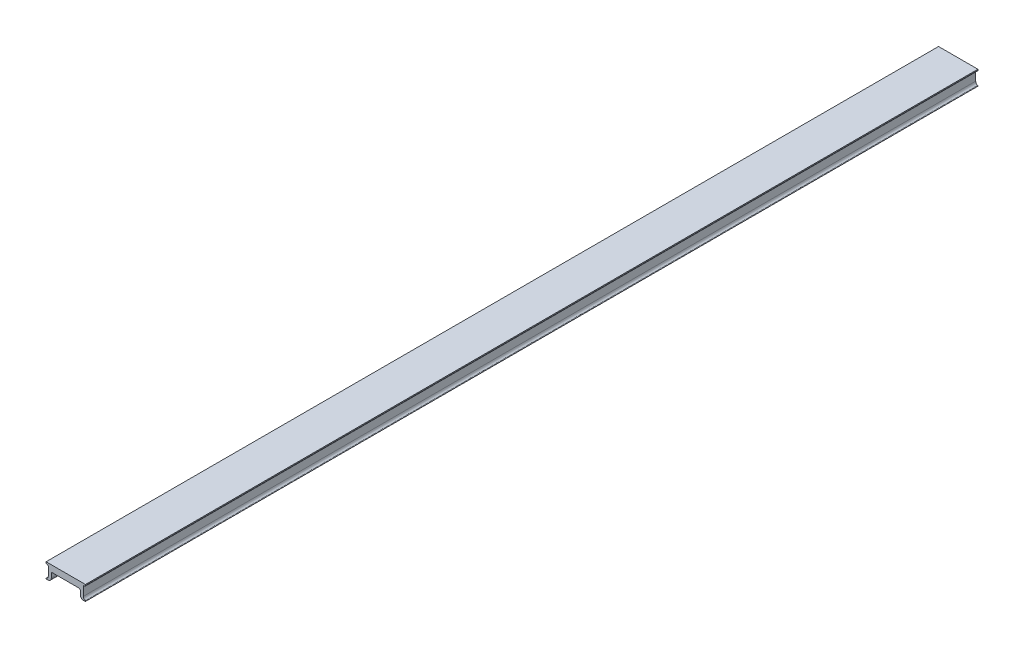
ISO-10303-21;
HEADER;
FILE_DESCRIPTION(('STEP AP214'),'2;1');
FILE_NAME('part.step','',(''),(''),'','','');
FILE_SCHEMA(('AUTOMOTIVE_DESIGN { 1 0 10303 214 1 1 1 1 }'));
ENDSEC;
DATA;
#1=APPLICATION_CONTEXT('core data for automotive mechanical design processes');
#2=APPLICATION_PROTOCOL_DEFINITION('international standard','automotive_design',2000,#1);
#3=PRODUCT_CONTEXT('',#1,'mechanical');
#4=PRODUCT('Part','Part','',(#3));
#5=PRODUCT_RELATED_PRODUCT_CATEGORY('part','',(#4));
#6=PRODUCT_DEFINITION_FORMATION('','',#4);
#7=PRODUCT_DEFINITION_CONTEXT('part definition',#1,'design');
#8=PRODUCT_DEFINITION('design','',#6,#7);
#9=PRODUCT_DEFINITION_SHAPE('','',#8);
#10=(LENGTH_UNIT() NAMED_UNIT(*) SI_UNIT(.MILLI.,.METRE.));
#11=(NAMED_UNIT(*) PLANE_ANGLE_UNIT() SI_UNIT($,.RADIAN.));
#12=(NAMED_UNIT(*) SI_UNIT($,.STERADIAN.) SOLID_ANGLE_UNIT());
#13=UNCERTAINTY_MEASURE_WITH_UNIT(LENGTH_MEASURE(1.E-05),#10,'distance_accuracy_value','');
#14=(GEOMETRIC_REPRESENTATION_CONTEXT(3) GLOBAL_UNCERTAINTY_ASSIGNED_CONTEXT((#13)) GLOBAL_UNIT_ASSIGNED_CONTEXT((#10,
#11,#12)) REPRESENTATION_CONTEXT('',''));
#15=CARTESIAN_POINT('',(0.,0.,0.));
#16=DIRECTION('',(0.,0.,1.));
#17=DIRECTION('',(1.,0.,0.));
#18=AXIS2_PLACEMENT_3D('',#15,#16,#17);
#19=CARTESIAN_POINT('',(92.0798797086991,47.7694772301879,204.));
#20=DIRECTION('',(0.,0.,-1.));
#21=DIRECTION('',(-1.,0.,0.));
#22=AXIS2_PLACEMENT_3D('',#19,#20,#21);
#23=CYLINDRICAL_SURFACE('',#22,0.0905822297343618);
#24=CARTESIAN_POINT('',(92.0798797086991,47.7694772301879,0.));
#25=DIRECTION('',(0.,0.,1.));
#26=DIRECTION('',(1.,0.,0.));
#27=AXIS2_PLACEMENT_3D('',#24,#25,#26);
#28=CIRCLE('',#27,0.0905822297343618);
#29=CARTESIAN_POINT('',(92.0765771921593,47.85999923706,0.));
#30=VERTEX_POINT('',#29);
#31=CARTESIAN_POINT('',(92.0831822252388,47.6789552233158,0.));
#32=VERTEX_POINT('',#31);
#33=EDGE_CURVE('E227',#30,#32,#28,.T.);
#34=ORIENTED_EDGE('',*,*,#33,.T.);
#35=DIRECTION('',(0.,0.,-1.));
#36=VECTOR('',#35,1.);
#37=CARTESIAN_POINT('',(92.0831822252388,47.6789552233158,204.));
#38=LINE('',#37,#36);
#39=CARTESIAN_POINT('',(92.0831822252388,47.6789552233158,204.));
#40=VERTEX_POINT('',#39);
#41=EDGE_CURVE('E11',#40,#32,#38,.T.);
#42=ORIENTED_EDGE('',*,*,#41,.F.);
#43=CARTESIAN_POINT('',(92.0798797086991,47.7694772301879,204.));
#44=DIRECTION('',(0.,0.,1.));
#45=DIRECTION('',(1.,0.,0.));
#46=AXIS2_PLACEMENT_3D('',#43,#44,#45);
#47=CIRCLE('',#46,0.0905822297343618);
#48=CARTESIAN_POINT('',(92.0765771921593,47.85999923706,204.));
#49=VERTEX_POINT('',#48);
#50=EDGE_CURVE('E273',#49,#40,#47,.T.);
#51=ORIENTED_EDGE('',*,*,#50,.F.);
#52=DIRECTION('',(0.,0.,-1.));
#53=VECTOR('',#52,1.);
#54=CARTESIAN_POINT('',(92.0765771921593,47.85999923706,204.));
#55=LINE('',#54,#53);
#56=EDGE_CURVE('E223',#49,#30,#55,.T.);
#57=ORIENTED_EDGE('',*,*,#56,.T.);
#58=EDGE_LOOP('',(#34,#42,#51,#57));
#59=FACE_BOUND('',#58,.T.);
#60=ADVANCED_FACE('F35',(#59),#23,.T.);
#61=CARTESIAN_POINT('',(92.0831822252388,47.6789552233158,204.));
#62=DIRECTION('',(0.,1.,0.));
#63=DIRECTION('',(0.,0.,1.));
#64=AXIS2_PLACEMENT_3D('',#61,#62,#63);
#65=PLANE('',#64);
#66=DIRECTION('',(1.,0.,0.));
#67=VECTOR('',#66,1.);
#68=CARTESIAN_POINT('',(92.0831822252388,47.6789552233158,0.));
#69=LINE('',#68,#67);
#70=CARTESIAN_POINT('',(92.4427267101637,47.6789552233158,0.));
#71=VERTEX_POINT('',#70);
#72=EDGE_CURVE('E230',#32,#71,#69,.T.);
#73=ORIENTED_EDGE('',*,*,#72,.T.);
#74=DIRECTION('',(0.,0.,-1.));
#75=VECTOR('',#74,1.);
#76=CARTESIAN_POINT('',(92.4427267101637,47.6789552233158,204.));
#77=LINE('',#76,#75);
#78=CARTESIAN_POINT('',(92.4427267101637,47.6789552233158,204.));
#79=VERTEX_POINT('',#78);
#80=EDGE_CURVE('E43',#79,#71,#77,.T.);
#81=ORIENTED_EDGE('',*,*,#80,.F.);
#82=DIRECTION('',(1.,0.,0.));
#83=VECTOR('',#82,1.);
#84=CARTESIAN_POINT('',(92.0831822252388,47.6789552233158,204.));
#85=LINE('',#84,#83);
#86=EDGE_CURVE('E142',#40,#79,#85,.T.);
#87=ORIENTED_EDGE('',*,*,#86,.F.);
#88=ORIENTED_EDGE('',*,*,#41,.T.);
#89=EDGE_LOOP('',(#73,#81,#87,#88));
#90=FACE_BOUND('',#89,.T.);
#91=ADVANCED_FACE('F411',(#90),#65,.F.);
#92=CARTESIAN_POINT('',(92.4427267101637,48.4365448007215,204.));
#93=DIRECTION('',(0.,0.,-1.));
#94=DIRECTION('',(-1.,0.,0.));
#95=AXIS2_PLACEMENT_3D('',#92,#93,#94);
#96=CYLINDRICAL_SURFACE('',#95,0.757589577405737);
#97=CARTESIAN_POINT('',(92.4427267101637,48.4365448007215,0.));
#98=DIRECTION('',(0.,0.,1.));
#99=DIRECTION('',(1.,0.,0.));
#100=AXIS2_PLACEMENT_3D('',#97,#98,#99);
#101=CIRCLE('',#100,0.757589577405737);
#102=CARTESIAN_POINT('',(93.2003162875694,48.4365448007215,0.));
#103=VERTEX_POINT('',#102);
#104=EDGE_CURVE('E232',#71,#103,#101,.T.);
#105=ORIENTED_EDGE('',*,*,#104,.T.);
#106=DIRECTION('',(0.,0.,-1.));
#107=VECTOR('',#106,1.);
#108=CARTESIAN_POINT('',(93.2003162875694,48.4365448007215,204.));
#109=LINE('',#108,#107);
#110=CARTESIAN_POINT('',(93.2003162875694,48.4365448007215,204.));
#111=VERTEX_POINT('',#110);
#112=EDGE_CURVE('E328',#111,#103,#109,.T.);
#113=ORIENTED_EDGE('',*,*,#112,.F.);
#114=CARTESIAN_POINT('',(92.4427267101637,48.4365448007215,204.));
#115=DIRECTION('',(0.,0.,1.));
#116=DIRECTION('',(1.,0.,0.));
#117=AXIS2_PLACEMENT_3D('',#114,#115,#116);
#118=CIRCLE('',#117,0.757589577405737);
#119=EDGE_CURVE('E336',#79,#111,#118,.T.);
#120=ORIENTED_EDGE('',*,*,#119,.F.);
#121=ORIENTED_EDGE('',*,*,#80,.T.);
#122=EDGE_LOOP('',(#105,#113,#120,#121));
#123=FACE_BOUND('',#122,.T.);
#124=ADVANCED_FACE('F334',(#123),#96,.T.);
#125=CARTESIAN_POINT('',(93.2003162875694,48.4365448007215,204.));
#126=DIRECTION('',(-1.,0.,0.));
#127=DIRECTION('',(0.,0.,1.));
#128=AXIS2_PLACEMENT_3D('',#125,#126,#127);
#129=PLANE('',#128);
#130=DIRECTION('',(0.,1.,0.));
#131=VECTOR('',#130,1.);
#132=CARTESIAN_POINT('',(93.2003162875694,48.4365448007215,0.));
#133=LINE('',#132,#131);
#134=CARTESIAN_POINT('',(93.2003162875694,49.3599996264019,0.));
#135=VERTEX_POINT('',#134);
#136=EDGE_CURVE('E234',#103,#135,#133,.T.);
#137=ORIENTED_EDGE('',*,*,#136,.T.);
#138=DIRECTION('',(0.,0.,-1.));
#139=VECTOR('',#138,1.);
#140=CARTESIAN_POINT('',(93.2003162875694,49.3599996264019,204.));
#141=LINE('',#140,#139);
#142=CARTESIAN_POINT('',(93.2003162875694,49.3599996264019,204.));
#143=VERTEX_POINT('',#142);
#144=EDGE_CURVE('E325',#143,#135,#141,.T.);
#145=ORIENTED_EDGE('',*,*,#144,.F.);
#146=DIRECTION('',(0.,1.,0.));
#147=VECTOR('',#146,1.);
#148=CARTESIAN_POINT('',(93.2003162875694,48.4365448007215,204.));
#149=LINE('',#148,#147);
#150=EDGE_CURVE('E354',#111,#143,#149,.T.);
#151=ORIENTED_EDGE('',*,*,#150,.F.);
#152=ORIENTED_EDGE('',*,*,#112,.T.);
#153=EDGE_LOOP('',(#137,#145,#151,#152));
#154=FACE_BOUND('',#153,.T.);
#155=ADVANCED_FACE('F345',(#154),#129,.F.);
#156=CARTESIAN_POINT('',(93.4588951350298,49.3599996264019,204.));
#157=DIRECTION('',(0.,0.,-1.));
#158=DIRECTION('',(-1.,0.,0.));
#159=AXIS2_PLACEMENT_3D('',#156,#157,#158);
#160=CYLINDRICAL_SURFACE('',#159,0.258578847460375);
#161=CARTESIAN_POINT('',(93.4588951350298,49.3599996264019,0.));
#162=DIRECTION('',(0.,0.,-1.));
#163=DIRECTION('',(-1.,0.,0.));
#164=AXIS2_PLACEMENT_3D('',#161,#162,#163);
#165=CIRCLE('',#164,0.258578847460375);
#166=CARTESIAN_POINT('',(93.4588951350298,49.6185784738623,0.));
#167=VERTEX_POINT('',#166);
#168=EDGE_CURVE('E236',#135,#167,#165,.T.);
#169=ORIENTED_EDGE('',*,*,#168,.T.);
#170=DIRECTION('',(0.,0.,-1.));
#171=VECTOR('',#170,1.);
#172=CARTESIAN_POINT('',(93.4588951350298,49.6185784738623,204.));
#173=LINE('',#172,#171);
#174=CARTESIAN_POINT('',(93.4588951350298,49.6185784738623,204.));
#175=VERTEX_POINT('',#174);
#176=EDGE_CURVE('E322',#175,#167,#173,.T.);
#177=ORIENTED_EDGE('',*,*,#176,.F.);
#178=CARTESIAN_POINT('',(93.4588951350298,49.3599996264019,204.));
#179=DIRECTION('',(0.,0.,-1.));
#180=DIRECTION('',(-1.,0.,0.));
#181=AXIS2_PLACEMENT_3D('',#178,#179,#180);
#182=CIRCLE('',#181,0.258578847460375);
#183=EDGE_CURVE('E351',#143,#175,#182,.T.);
#184=ORIENTED_EDGE('',*,*,#183,.F.);
#185=ORIENTED_EDGE('',*,*,#144,.T.);
#186=EDGE_LOOP('',(#169,#177,#184,#185));
#187=FACE_BOUND('',#186,.T.);
#188=ADVANCED_FACE('F349',(#187),#160,.F.);
#189=CARTESIAN_POINT('',(93.4588951350298,49.6185784738623,204.));
#190=DIRECTION('',(0.,1.,0.));
#191=DIRECTION('',(0.,0.,1.));
#192=AXIS2_PLACEMENT_3D('',#189,#190,#191);
#193=PLANE('',#192);
#194=DIRECTION('',(1.,0.,0.));
#195=VECTOR('',#194,1.);
#196=CARTESIAN_POINT('',(93.4588951350298,49.6185784738623,0.));
#197=LINE('',#196,#195);
#198=CARTESIAN_POINT('',(99.5611048649701,49.6185784738623,0.));
#199=VERTEX_POINT('',#198);
#200=EDGE_CURVE('E238',#167,#199,#197,.T.);
#201=ORIENTED_EDGE('',*,*,#200,.T.);
#202=DIRECTION('',(0.,0.,-1.));
#203=VECTOR('',#202,1.);
#204=CARTESIAN_POINT('',(99.5611048649701,49.6185784738623,204.));
#205=LINE('',#204,#203);
#206=CARTESIAN_POINT('',(99.5611048649701,49.6185784738623,204.));
#207=VERTEX_POINT('',#206);
#208=EDGE_CURVE('E319',#207,#199,#205,.T.);
#209=ORIENTED_EDGE('',*,*,#208,.F.);
#210=DIRECTION('',(1.,0.,0.));
#211=VECTOR('',#210,1.);
#212=CARTESIAN_POINT('',(93.4588951350298,49.6185784738623,204.));
#213=LINE('',#212,#211);
#214=EDGE_CURVE('E353',#175,#207,#213,.T.);
#215=ORIENTED_EDGE('',*,*,#214,.F.);
#216=ORIENTED_EDGE('',*,*,#176,.T.);
#217=EDGE_LOOP('',(#201,#209,#215,#216));
#218=FACE_BOUND('',#217,.T.);
#219=ADVANCED_FACE('F424',(#218),#193,.F.);
#220=CARTESIAN_POINT('',(99.5611048649701,49.3599996264019,204.));
#221=DIRECTION('',(0.,0.,-1.));
#222=DIRECTION('',(-1.,0.,0.));
#223=AXIS2_PLACEMENT_3D('',#220,#221,#222);
#224=CYLINDRICAL_SURFACE('',#223,0.258578847460375);
#225=CARTESIAN_POINT('',(99.5611048649701,49.3599996264019,0.));
#226=DIRECTION('',(0.,0.,-1.));
#227=DIRECTION('',(1.,0.,0.));
#228=AXIS2_PLACEMENT_3D('',#225,#226,#227);
#229=CIRCLE('',#228,0.258578847460375);
#230=CARTESIAN_POINT('',(99.8196837124304,49.3599996264019,0.));
#231=VERTEX_POINT('',#230);
#232=EDGE_CURVE('E240',#199,#231,#229,.T.);
#233=ORIENTED_EDGE('',*,*,#232,.T.);
#234=DIRECTION('',(0.,0.,-1.));
#235=VECTOR('',#234,1.);
#236=CARTESIAN_POINT('',(99.8196837124304,49.3599996264019,204.));
#237=LINE('',#236,#235);
#238=CARTESIAN_POINT('',(99.8196837124304,49.3599996264019,204.));
#239=VERTEX_POINT('',#238);
#240=EDGE_CURVE('E316',#239,#231,#237,.T.);
#241=ORIENTED_EDGE('',*,*,#240,.F.);
#242=CARTESIAN_POINT('',(99.5611048649701,49.3599996264019,204.));
#243=DIRECTION('',(0.,0.,-1.));
#244=DIRECTION('',(1.,0.,0.));
#245=AXIS2_PLACEMENT_3D('',#242,#243,#244);
#246=CIRCLE('',#245,0.258578847460375);
#247=EDGE_CURVE('E356',#207,#239,#246,.T.);
#248=ORIENTED_EDGE('',*,*,#247,.F.);
#249=ORIENTED_EDGE('',*,*,#208,.T.);
#250=EDGE_LOOP('',(#233,#241,#248,#249));
#251=FACE_BOUND('',#250,.T.);
#252=ADVANCED_FACE('F427',(#251),#224,.F.);
#253=CARTESIAN_POINT('',(99.8196837124304,48.4365448007215,204.));
#254=DIRECTION('',(1.,0.,0.));
#255=DIRECTION('',(0.,0.,-1.));
#256=AXIS2_PLACEMENT_3D('',#253,#254,#255);
#257=PLANE('',#256);
#258=DIRECTION('',(0.,-1.,0.));
#259=VECTOR('',#258,1.);
#260=CARTESIAN_POINT('',(99.8196837124304,48.4365448007215,0.));
#261=LINE('',#260,#259);
#262=CARTESIAN_POINT('',(99.8196837124304,48.4365448007215,0.));
#263=VERTEX_POINT('',#262);
#264=EDGE_CURVE('E242',#231,#263,#261,.T.);
#265=ORIENTED_EDGE('',*,*,#264,.T.);
#266=DIRECTION('',(0.,0.,-1.));
#267=VECTOR('',#266,1.);
#268=CARTESIAN_POINT('',(99.8196837124304,48.4365448007215,204.));
#269=LINE('',#268,#267);
#270=CARTESIAN_POINT('',(99.8196837124304,48.4365448007215,204.));
#271=VERTEX_POINT('',#270);
#272=EDGE_CURVE('E313',#271,#263,#269,.T.);
#273=ORIENTED_EDGE('',*,*,#272,.F.);
#274=DIRECTION('',(0.,-1.,0.));
#275=VECTOR('',#274,1.);
#276=CARTESIAN_POINT('',(99.8196837124304,48.4365448007215,204.));
#277=LINE('',#276,#275);
#278=EDGE_CURVE('E362',#239,#271,#277,.T.);
#279=ORIENTED_EDGE('',*,*,#278,.F.);
#280=ORIENTED_EDGE('',*,*,#240,.T.);
#281=EDGE_LOOP('',(#265,#273,#279,#280));
#282=FACE_BOUND('',#281,.T.);
#283=ADVANCED_FACE('F431',(#282),#257,.F.);
#284=CARTESIAN_POINT('',(100.577273289836,48.4365448007215,204.));
#285=DIRECTION('',(0.,0.,-1.));
#286=DIRECTION('',(-1.,0.,0.));
#287=AXIS2_PLACEMENT_3D('',#284,#285,#286);
#288=CYLINDRICAL_SURFACE('',#287,0.757589577405737);
#289=CARTESIAN_POINT('',(100.577273289836,48.4365448007215,0.));
#290=DIRECTION('',(0.,0.,1.));
#291=DIRECTION('',(-1.,0.,0.));
#292=AXIS2_PLACEMENT_3D('',#289,#290,#291);
#293=CIRCLE('',#292,0.757589577405737);
#294=CARTESIAN_POINT('',(100.577273289836,47.6789552233158,0.));
#295=VERTEX_POINT('',#294);
#296=EDGE_CURVE('E244',#263,#295,#293,.T.);
#297=ORIENTED_EDGE('',*,*,#296,.T.);
#298=DIRECTION('',(0.,0.,-1.));
#299=VECTOR('',#298,1.);
#300=CARTESIAN_POINT('',(100.577273289836,47.6789552233158,204.));
#301=LINE('',#300,#299);
#302=CARTESIAN_POINT('',(100.577273289836,47.6789552233158,204.));
#303=VERTEX_POINT('',#302);
#304=EDGE_CURVE('E310',#303,#295,#301,.T.);
#305=ORIENTED_EDGE('',*,*,#304,.F.);
#306=CARTESIAN_POINT('',(100.577273289836,48.4365448007215,204.));
#307=DIRECTION('',(0.,0.,1.));
#308=DIRECTION('',(-1.,0.,0.));
#309=AXIS2_PLACEMENT_3D('',#306,#307,#308);
#310=CIRCLE('',#309,0.757589577405737);
#311=EDGE_CURVE('E364',#271,#303,#310,.T.);
#312=ORIENTED_EDGE('',*,*,#311,.F.);
#313=ORIENTED_EDGE('',*,*,#272,.T.);
#314=EDGE_LOOP('',(#297,#305,#312,#313));
#315=FACE_BOUND('',#314,.T.);
#316=ADVANCED_FACE('F435',(#315),#288,.T.);
#317=CARTESIAN_POINT('',(100.936817774761,47.6789552233158,204.));
#318=DIRECTION('',(0.,1.,0.));
#319=DIRECTION('',(0.,0.,1.));
#320=AXIS2_PLACEMENT_3D('',#317,#318,#319);
#321=PLANE('',#320);
#322=DIRECTION('',(1.,0.,0.));
#323=VECTOR('',#322,1.);
#324=CARTESIAN_POINT('',(100.936817774761,47.6789552233158,0.));
#325=LINE('',#324,#323);
#326=CARTESIAN_POINT('',(100.936817774761,47.6789552233158,0.));
#327=VERTEX_POINT('',#326);
#328=EDGE_CURVE('E246',#295,#327,#325,.T.);
#329=ORIENTED_EDGE('',*,*,#328,.T.);
#330=DIRECTION('',(0.,0.,-1.));
#331=VECTOR('',#330,1.);
#332=CARTESIAN_POINT('',(100.936817774761,47.6789552233158,204.));
#333=LINE('',#332,#331);
#334=CARTESIAN_POINT('',(100.936817774761,47.6789552233158,204.));
#335=VERTEX_POINT('',#334);
#336=EDGE_CURVE('E307',#335,#327,#333,.T.);
#337=ORIENTED_EDGE('',*,*,#336,.F.);
#338=DIRECTION('',(1.,0.,0.));
#339=VECTOR('',#338,1.);
#340=CARTESIAN_POINT('',(100.936817774761,47.6789552233158,204.));
#341=LINE('',#340,#339);
#342=EDGE_CURVE('E366',#303,#335,#341,.T.);
#343=ORIENTED_EDGE('',*,*,#342,.F.);
#344=ORIENTED_EDGE('',*,*,#304,.T.);
#345=EDGE_LOOP('',(#329,#337,#343,#344));
#346=FACE_BOUND('',#345,.T.);
#347=ADVANCED_FACE('F439',(#346),#321,.F.);
#348=CARTESIAN_POINT('',(100.940120291301,47.7694772301879,204.));
#349=DIRECTION('',(0.,0.,-1.));
#350=DIRECTION('',(-1.,0.,0.));
#351=AXIS2_PLACEMENT_3D('',#348,#349,#350);
#352=CYLINDRICAL_SURFACE('',#351,0.0905822297343653);
#353=CARTESIAN_POINT('',(100.940120291301,47.7694772301879,0.));
#354=DIRECTION('',(0.,0.,1.));
#355=DIRECTION('',(-1.,0.,0.));
#356=AXIS2_PLACEMENT_3D('',#353,#354,#355);
#357=CIRCLE('',#356,0.0905822297343653);
#358=CARTESIAN_POINT('',(100.943422807841,47.85999923706,0.));
#359=VERTEX_POINT('',#358);
#360=EDGE_CURVE('E248',#327,#359,#357,.T.);
#361=ORIENTED_EDGE('',*,*,#360,.T.);
#362=DIRECTION('',(0.,0.,-1.));
#363=VECTOR('',#362,1.);
#364=CARTESIAN_POINT('',(100.943422807841,47.85999923706,204.));
#365=LINE('',#364,#363);
#366=CARTESIAN_POINT('',(100.943422807841,47.85999923706,204.));
#367=VERTEX_POINT('',#366);
#368=EDGE_CURVE('E304',#367,#359,#365,.T.);
#369=ORIENTED_EDGE('',*,*,#368,.F.);
#370=CARTESIAN_POINT('',(100.940120291301,47.7694772301879,204.));
#371=DIRECTION('',(0.,0.,1.));
#372=DIRECTION('',(-1.,0.,0.));
#373=AXIS2_PLACEMENT_3D('',#370,#371,#372);
#374=CIRCLE('',#373,0.0905822297343653);
#375=EDGE_CURVE('E368',#335,#367,#374,.T.);
#376=ORIENTED_EDGE('',*,*,#375,.F.);
#377=ORIENTED_EDGE('',*,*,#336,.T.);
#378=EDGE_LOOP('',(#361,#369,#376,#377));
#379=FACE_BOUND('',#378,.T.);
#380=ADVANCED_FACE('F443',(#379),#352,.T.);
#381=CARTESIAN_POINT('',(101.109541588619,48.4365448007215,204.));
#382=DIRECTION('',(0.,0.,-1.));
#383=DIRECTION('',(-1.,0.,0.));
#384=AXIS2_PLACEMENT_3D('',#381,#382,#383);
#385=CYLINDRICAL_SURFACE('',#384,0.600000196920859);
#386=CARTESIAN_POINT('',(101.109541588619,48.4365448007215,0.));
#387=DIRECTION('',(0.,0.,-1.));
#388=DIRECTION('',(-1.,0.,0.));
#389=AXIS2_PLACEMENT_3D('',#386,#387,#388);
#390=CIRCLE('',#389,0.600000196920859);
#391=CARTESIAN_POINT('',(100.51,48.4599994339809,0.));
#392=VERTEX_POINT('',#391);
#393=EDGE_CURVE('E250',#359,#392,#390,.T.);
#394=ORIENTED_EDGE('',*,*,#393,.T.);
#395=DIRECTION('',(0.,0.,-1.));
#396=VECTOR('',#395,1.);
#397=CARTESIAN_POINT('',(100.51,48.4599994339809,204.));
#398=LINE('',#397,#396);
#399=CARTESIAN_POINT('',(100.51,48.4599994339809,204.));
#400=VERTEX_POINT('',#399);
#401=EDGE_CURVE('E301',#400,#392,#398,.T.);
#402=ORIENTED_EDGE('',*,*,#401,.F.);
#403=CARTESIAN_POINT('',(101.109541588619,48.4365448007215,204.));
#404=DIRECTION('',(0.,0.,-1.));
#405=DIRECTION('',(-1.,0.,0.));
#406=AXIS2_PLACEMENT_3D('',#403,#404,#405);
#407=CIRCLE('',#406,0.600000196920859);
#408=EDGE_CURVE('E370',#367,#400,#407,.T.);
#409=ORIENTED_EDGE('',*,*,#408,.F.);
#410=ORIENTED_EDGE('',*,*,#368,.T.);
#411=EDGE_LOOP('',(#394,#402,#409,#410));
#412=FACE_BOUND('',#411,.T.);
#413=ADVANCED_FACE('F447',(#412),#385,.F.);
#414=CARTESIAN_POINT('',(100.51,48.4599994339809,204.));
#415=DIRECTION('',(-1.,0.,0.));
#416=DIRECTION('',(0.,-1.,0.));
#417=AXIS2_PLACEMENT_3D('',#414,#415,#416);
#418=PLANE('',#417);
#419=DIRECTION('',(0.,1.,0.));
#420=VECTOR('',#419,1.);
#421=CARTESIAN_POINT('',(100.51,48.4599994339809,0.));
#422=LINE('',#421,#420);
#423=CARTESIAN_POINT('',(100.51,50.4599994339809,0.));
#424=VERTEX_POINT('',#423);
#425=EDGE_CURVE('E252',#392,#424,#422,.T.);
#426=ORIENTED_EDGE('',*,*,#425,.T.);
#427=DIRECTION('',(0.,0.,-1.));
#428=VECTOR('',#427,1.);
#429=CARTESIAN_POINT('',(100.51,50.4599994339809,204.));
#430=LINE('',#429,#428);
#431=CARTESIAN_POINT('',(100.51,50.4599994339809,204.));
#432=VERTEX_POINT('',#431);
#433=EDGE_CURVE('E298',#432,#424,#430,.T.);
#434=ORIENTED_EDGE('',*,*,#433,.F.);
#435=DIRECTION('',(0.,1.,0.));
#436=VECTOR('',#435,1.);
#437=CARTESIAN_POINT('',(100.51,48.4599994339809,204.));
#438=LINE('',#437,#436);
#439=EDGE_CURVE('E372',#400,#432,#438,.T.);
#440=ORIENTED_EDGE('',*,*,#439,.F.);
#441=ORIENTED_EDGE('',*,*,#401,.T.);
#442=EDGE_LOOP('',(#426,#434,#440,#441));
#443=FACE_BOUND('',#442,.T.);
#444=ADVANCED_FACE('F451',(#443),#418,.F.);
#445=CARTESIAN_POINT('',(100.710000373598,50.4599994339809,204.));
#446=DIRECTION('',(0.,0.,-1.));
#447=DIRECTION('',(-1.,0.,0.));
#448=AXIS2_PLACEMENT_3D('',#445,#446,#447);
#449=CYLINDRICAL_SURFACE('',#448,0.200000373597978);
#450=CARTESIAN_POINT('',(100.710000373598,50.4599994339809,0.));
#451=DIRECTION('',(0.,0.,-1.));
#452=DIRECTION('',(-1.,0.,0.));
#453=AXIS2_PLACEMENT_3D('',#450,#451,#452);
#454=CIRCLE('',#453,0.200000373597978);
#455=CARTESIAN_POINT('',(100.710000373598,50.6599998075789,0.));
#456=VERTEX_POINT('',#455);
#457=EDGE_CURVE('E254',#424,#456,#454,.T.);
#458=ORIENTED_EDGE('',*,*,#457,.T.);
#459=DIRECTION('',(0.,0.,-1.));
#460=VECTOR('',#459,1.);
#461=CARTESIAN_POINT('',(100.710000373598,50.6599998075789,204.));
#462=LINE('',#461,#460);
#463=CARTESIAN_POINT('',(100.710000373598,50.6599998075789,204.));
#464=VERTEX_POINT('',#463);
#465=EDGE_CURVE('E295',#464,#456,#462,.T.);
#466=ORIENTED_EDGE('',*,*,#465,.F.);
#467=CARTESIAN_POINT('',(100.710000373598,50.4599994339809,204.));
#468=DIRECTION('',(0.,0.,-1.));
#469=DIRECTION('',(-1.,0.,0.));
#470=AXIS2_PLACEMENT_3D('',#467,#468,#469);
#471=CIRCLE('',#470,0.200000373597978);
#472=EDGE_CURVE('E374',#432,#464,#471,.T.);
#473=ORIENTED_EDGE('',*,*,#472,.F.);
#474=ORIENTED_EDGE('',*,*,#433,.T.);
#475=EDGE_LOOP('',(#458,#466,#473,#474));
#476=FACE_BOUND('',#475,.T.);
#477=ADVANCED_FACE('F455',(#476),#449,.F.);
#478=CARTESIAN_POINT('',(100.710000373598,50.6599998075789,204.));
#479=DIRECTION('',(0.,1.,0.));
#480=DIRECTION('',(0.,0.,1.));
#481=AXIS2_PLACEMENT_3D('',#478,#479,#480);
#482=PLANE('',#481);
#483=DIRECTION('',(1.,0.,0.));
#484=VECTOR('',#483,1.);
#485=CARTESIAN_POINT('',(100.710000373598,50.6599998075789,0.));
#486=LINE('',#485,#484);
#487=CARTESIAN_POINT('',(100.810000144262,50.6599998075789,0.));
#488=VERTEX_POINT('',#487);
#489=EDGE_CURVE('E256',#456,#488,#486,.T.);
#490=ORIENTED_EDGE('',*,*,#489,.T.);
#491=DIRECTION('',(0.,0.,-1.));
#492=VECTOR('',#491,1.);
#493=CARTESIAN_POINT('',(100.810000144262,50.6599998075789,204.));
#494=LINE('',#493,#492);
#495=CARTESIAN_POINT('',(100.810000144262,50.6599998075789,204.));
#496=VERTEX_POINT('',#495);
#497=EDGE_CURVE('E292',#496,#488,#494,.T.);
#498=ORIENTED_EDGE('',*,*,#497,.F.);
#499=DIRECTION('',(1.,0.,0.));
#500=VECTOR('',#499,1.);
#501=CARTESIAN_POINT('',(100.710000373598,50.6599998075789,204.));
#502=LINE('',#501,#500);
#503=EDGE_CURVE('E376',#464,#496,#502,.T.);
#504=ORIENTED_EDGE('',*,*,#503,.F.);
#505=ORIENTED_EDGE('',*,*,#465,.T.);
#506=EDGE_LOOP('',(#490,#498,#504,#505));
#507=FACE_BOUND('',#506,.T.);
#508=ADVANCED_FACE('F459',(#507),#482,.F.);
#509=CARTESIAN_POINT('',(100.810000144262,50.859999227503,204.));
#510=DIRECTION('',(0.,0.,-1.));
#511=DIRECTION('',(-1.,0.,0.));
#512=AXIS2_PLACEMENT_3D('',#509,#510,#511);
#513=CYLINDRICAL_SURFACE('',#512,0.199999419924105);
#514=CARTESIAN_POINT('',(100.810000144262,50.859999227503,0.));
#515=DIRECTION('',(0.,0.,1.));
#516=DIRECTION('',(-1.,0.,0.));
#517=AXIS2_PLACEMENT_3D('',#514,#515,#516);
#518=CIRCLE('',#517,0.199999419924105);
#519=CARTESIAN_POINT('',(101.009999564186,50.859999227503,0.));
#520=VERTEX_POINT('',#519);
#521=EDGE_CURVE('E258',#488,#520,#518,.T.);
#522=ORIENTED_EDGE('',*,*,#521,.T.);
#523=DIRECTION('',(0.,0.,-1.));
#524=VECTOR('',#523,1.);
#525=CARTESIAN_POINT('',(101.009999564186,50.859999227503,204.));
#526=LINE('',#525,#524);
#527=CARTESIAN_POINT('',(101.009999564186,50.859999227503,204.));
#528=VERTEX_POINT('',#527);
#529=EDGE_CURVE('E289',#528,#520,#526,.T.);
#530=ORIENTED_EDGE('',*,*,#529,.F.);
#531=CARTESIAN_POINT('',(100.810000144262,50.859999227503,204.));
#532=DIRECTION('',(0.,0.,1.));
#533=DIRECTION('',(-1.,0.,0.));
#534=AXIS2_PLACEMENT_3D('',#531,#532,#533);
#535=CIRCLE('',#534,0.199999419924105);
#536=EDGE_CURVE('E378',#496,#528,#535,.T.);
#537=ORIENTED_EDGE('',*,*,#536,.F.);
#538=ORIENTED_EDGE('',*,*,#497,.T.);
#539=EDGE_LOOP('',(#522,#530,#537,#538));
#540=FACE_BOUND('',#539,.T.);
#541=ADVANCED_FACE('F463',(#540),#513,.T.);
#542=CARTESIAN_POINT('',(101.009999564186,50.859999227503,204.));
#543=DIRECTION('',(-1.,0.,0.));
#544=DIRECTION('',(0.,0.,1.));
#545=AXIS2_PLACEMENT_3D('',#542,#543,#544);
#546=PLANE('',#545);
#547=DIRECTION('',(0.,1.,0.));
#548=VECTOR('',#547,1.);
#549=CARTESIAN_POINT('',(101.009999564186,50.859999227503,0.));
#550=LINE('',#549,#548);
#551=CARTESIAN_POINT('',(101.009999564186,51.0774148376445,0.));
#552=VERTEX_POINT('',#551);
#553=EDGE_CURVE('E260',#520,#552,#550,.T.);
#554=ORIENTED_EDGE('',*,*,#553,.T.);
#555=DIRECTION('',(0.,0.,-1.));
#556=VECTOR('',#555,1.);
#557=CARTESIAN_POINT('',(101.009999564186,51.0774148376445,204.));
#558=LINE('',#557,#556);
#559=CARTESIAN_POINT('',(101.009999564186,51.0774148376445,204.));
#560=VERTEX_POINT('',#559);
#561=EDGE_CURVE('E286',#560,#552,#558,.T.);
#562=ORIENTED_EDGE('',*,*,#561,.F.);
#563=DIRECTION('',(0.,1.,0.));
#564=VECTOR('',#563,1.);
#565=CARTESIAN_POINT('',(101.009999564186,50.859999227503,204.));
#566=LINE('',#565,#564);
#567=EDGE_CURVE('E380',#528,#560,#566,.T.);
#568=ORIENTED_EDGE('',*,*,#567,.F.);
#569=ORIENTED_EDGE('',*,*,#529,.T.);
#570=EDGE_LOOP('',(#554,#562,#568,#569));
#571=FACE_BOUND('',#570,.T.);
#572=ADVANCED_FACE('F467',(#571),#546,.F.);
#573=CARTESIAN_POINT('',(92.010000435814,51.0774148376445,204.));
#574=DIRECTION('',(0.,-1.,0.));
#575=DIRECTION('',(0.,0.,-1.));
#576=AXIS2_PLACEMENT_3D('',#573,#574,#575);
#577=PLANE('',#576);
#578=DIRECTION('',(-1.,0.,0.));
#579=VECTOR('',#578,1.);
#580=CARTESIAN_POINT('',(92.010000435814,51.0774148376445,0.));
#581=LINE('',#580,#579);
#582=CARTESIAN_POINT('',(92.010000435814,51.0774148376445,0.));
#583=VERTEX_POINT('',#582);
#584=EDGE_CURVE('E262',#552,#583,#581,.T.);
#585=ORIENTED_EDGE('',*,*,#584,.T.);
#586=DIRECTION('',(0.,0.,-1.));
#587=VECTOR('',#586,1.);
#588=CARTESIAN_POINT('',(92.010000435814,51.0774148376445,204.));
#589=LINE('',#588,#587);
#590=CARTESIAN_POINT('',(92.010000435814,51.0774148376445,204.));
#591=VERTEX_POINT('',#590);
#592=EDGE_CURVE('E283',#591,#583,#589,.T.);
#593=ORIENTED_EDGE('',*,*,#592,.F.);
#594=DIRECTION('',(-1.,0.,0.));
#595=VECTOR('',#594,1.);
#596=CARTESIAN_POINT('',(92.010000435814,51.0774148376445,204.));
#597=LINE('',#596,#595);
#598=EDGE_CURVE('E382',#560,#591,#597,.T.);
#599=ORIENTED_EDGE('',*,*,#598,.F.);
#600=ORIENTED_EDGE('',*,*,#561,.T.);
#601=EDGE_LOOP('',(#585,#593,#599,#600));
#602=FACE_BOUND('',#601,.T.);
#603=ADVANCED_FACE('F471',(#602),#577,.F.);
#604=CARTESIAN_POINT('',(92.010000435814,50.859999227503,204.));
#605=DIRECTION('',(1.,0.,0.));
#606=DIRECTION('',(0.,0.,-1.));
#607=AXIS2_PLACEMENT_3D('',#604,#605,#606);
#608=PLANE('',#607);
#609=DIRECTION('',(0.,-1.,0.));
#610=VECTOR('',#609,1.);
#611=CARTESIAN_POINT('',(92.010000435814,50.859999227503,0.));
#612=LINE('',#611,#610);
#613=CARTESIAN_POINT('',(92.010000435814,50.859999227503,0.));
#614=VERTEX_POINT('',#613);
#615=EDGE_CURVE('E264',#583,#614,#612,.T.);
#616=ORIENTED_EDGE('',*,*,#615,.T.);
#617=DIRECTION('',(0.,0.,-1.));
#618=VECTOR('',#617,1.);
#619=CARTESIAN_POINT('',(92.010000435814,50.859999227503,204.));
#620=LINE('',#619,#618);
#621=CARTESIAN_POINT('',(92.010000435814,50.859999227503,204.));
#622=VERTEX_POINT('',#621);
#623=EDGE_CURVE('E280',#622,#614,#620,.T.);
#624=ORIENTED_EDGE('',*,*,#623,.F.);
#625=DIRECTION('',(0.,-1.,0.));
#626=VECTOR('',#625,1.);
#627=CARTESIAN_POINT('',(92.010000435814,50.859999227503,204.));
#628=LINE('',#627,#626);
#629=EDGE_CURVE('E384',#591,#622,#628,.T.);
#630=ORIENTED_EDGE('',*,*,#629,.F.);
#631=ORIENTED_EDGE('',*,*,#592,.T.);
#632=EDGE_LOOP('',(#616,#624,#630,#631));
#633=FACE_BOUND('',#632,.T.);
#634=ADVANCED_FACE('F475',(#633),#608,.F.);
#635=CARTESIAN_POINT('',(92.2099998557381,50.859999227503,204.));
#636=DIRECTION('',(0.,0.,-1.));
#637=DIRECTION('',(-1.,0.,0.));
#638=AXIS2_PLACEMENT_3D('',#635,#636,#637);
#639=CYLINDRICAL_SURFACE('',#638,0.199999419924105);
#640=CARTESIAN_POINT('',(92.2099998557381,50.859999227503,0.));
#641=DIRECTION('',(0.,0.,1.));
#642=DIRECTION('',(1.,0.,0.));
#643=AXIS2_PLACEMENT_3D('',#640,#641,#642);
#644=CIRCLE('',#643,0.199999419924105);
#645=CARTESIAN_POINT('',(92.2099998557381,50.6599998075789,0.));
#646=VERTEX_POINT('',#645);
#647=EDGE_CURVE('E266',#614,#646,#644,.T.);
#648=ORIENTED_EDGE('',*,*,#647,.T.);
#649=DIRECTION('',(0.,0.,-1.));
#650=VECTOR('',#649,1.);
#651=CARTESIAN_POINT('',(92.2099998557381,50.6599998075789,204.));
#652=LINE('',#651,#650);
#653=CARTESIAN_POINT('',(92.2099998557381,50.6599998075789,204.));
#654=VERTEX_POINT('',#653);
#655=EDGE_CURVE('E277',#654,#646,#652,.T.);
#656=ORIENTED_EDGE('',*,*,#655,.F.);
#657=CARTESIAN_POINT('',(92.2099998557381,50.859999227503,204.));
#658=DIRECTION('',(0.,0.,1.));
#659=DIRECTION('',(1.,0.,0.));
#660=AXIS2_PLACEMENT_3D('',#657,#658,#659);
#661=CIRCLE('',#660,0.199999419924105);
#662=EDGE_CURVE('E386',#622,#654,#661,.T.);
#663=ORIENTED_EDGE('',*,*,#662,.F.);
#664=ORIENTED_EDGE('',*,*,#623,.T.);
#665=EDGE_LOOP('',(#648,#656,#663,#664));
#666=FACE_BOUND('',#665,.T.);
#667=ADVANCED_FACE('F392',(#666),#639,.T.);
#668=CARTESIAN_POINT('',(92.3099996264019,50.6599998075789,204.));
#669=DIRECTION('',(0.,1.,0.));
#670=DIRECTION('',(0.,0.,1.));
#671=AXIS2_PLACEMENT_3D('',#668,#669,#670);
#672=PLANE('',#671);
#673=DIRECTION('',(1.,0.,0.));
#674=VECTOR('',#673,1.);
#675=CARTESIAN_POINT('',(92.3099996264019,50.6599998075789,0.));
#676=LINE('',#675,#674);
#677=CARTESIAN_POINT('',(92.3099996264019,50.6599998075789,0.));
#678=VERTEX_POINT('',#677);
#679=EDGE_CURVE('E268',#646,#678,#676,.T.);
#680=ORIENTED_EDGE('',*,*,#679,.T.);
#681=DIRECTION('',(0.,0.,-1.));
#682=VECTOR('',#681,1.);
#683=CARTESIAN_POINT('',(92.3099996264019,50.6599998075789,204.));
#684=LINE('',#683,#682);
#685=CARTESIAN_POINT('',(92.3099996264019,50.6599998075789,204.));
#686=VERTEX_POINT('',#685);
#687=EDGE_CURVE('E218',#686,#678,#684,.T.);
#688=ORIENTED_EDGE('',*,*,#687,.F.);
#689=DIRECTION('',(1.,0.,0.));
#690=VECTOR('',#689,1.);
#691=CARTESIAN_POINT('',(92.3099996264019,50.6599998075789,204.));
#692=LINE('',#691,#690);
#693=EDGE_CURVE('E209',#654,#686,#692,.T.);
#694=ORIENTED_EDGE('',*,*,#693,.F.);
#695=ORIENTED_EDGE('',*,*,#655,.T.);
#696=EDGE_LOOP('',(#680,#688,#694,#695));
#697=FACE_BOUND('',#696,.T.);
#698=ADVANCED_FACE('F396',(#697),#672,.F.);
#699=CARTESIAN_POINT('',(92.3099996264019,50.4599994339809,204.));
#700=DIRECTION('',(0.,0.,-1.));
#701=DIRECTION('',(-1.,0.,0.));
#702=AXIS2_PLACEMENT_3D('',#699,#700,#701);
#703=CYLINDRICAL_SURFACE('',#702,0.200000373597978);
#704=CARTESIAN_POINT('',(92.3099996264019,50.4599994339809,0.));
#705=DIRECTION('',(0.,0.,-1.));
#706=DIRECTION('',(1.,0.,0.));
#707=AXIS2_PLACEMENT_3D('',#704,#705,#706);
#708=CIRCLE('',#707,0.200000373597978);
#709=CARTESIAN_POINT('',(92.5099999999999,50.4599994339809,0.));
#710=VERTEX_POINT('',#709);
#711=EDGE_CURVE('E217',#678,#710,#708,.T.);
#712=ORIENTED_EDGE('',*,*,#711,.T.);
#713=DIRECTION('',(0.,0.,-1.));
#714=VECTOR('',#713,1.);
#715=CARTESIAN_POINT('',(92.5099999999999,50.4599994339809,204.));
#716=LINE('',#715,#714);
#717=CARTESIAN_POINT('',(92.5099999999999,50.4599994339809,204.));
#718=VERTEX_POINT('',#717);
#719=EDGE_CURVE('E214',#718,#710,#716,.T.);
#720=ORIENTED_EDGE('',*,*,#719,.F.);
#721=CARTESIAN_POINT('',(92.3099996264019,50.4599994339809,204.));
#722=DIRECTION('',(0.,0.,-1.));
#723=DIRECTION('',(1.,0.,0.));
#724=AXIS2_PLACEMENT_3D('',#721,#722,#723);
#725=CIRCLE('',#724,0.200000373597978);
#726=EDGE_CURVE('E203',#686,#718,#725,.T.);
#727=ORIENTED_EDGE('',*,*,#726,.F.);
#728=ORIENTED_EDGE('',*,*,#687,.T.);
#729=EDGE_LOOP('',(#712,#720,#727,#728));
#730=FACE_BOUND('',#729,.T.);
#731=ADVANCED_FACE('F215',(#730),#703,.F.);
#732=CARTESIAN_POINT('',(92.5099999999999,48.4599994339809,204.));
#733=DIRECTION('',(1.,0.,0.));
#734=DIRECTION('',(0.,1.,0.));
#735=AXIS2_PLACEMENT_3D('',#732,#733,#734);
#736=PLANE('',#735);
#737=DIRECTION('',(0.,-1.,0.));
#738=VECTOR('',#737,1.);
#739=CARTESIAN_POINT('',(92.5099999999999,48.4599994339809,0.));
#740=LINE('',#739,#738);
#741=CARTESIAN_POINT('',(92.5099999999999,48.4599994339809,0.));
#742=VERTEX_POINT('',#741);
#743=EDGE_CURVE('E128',#710,#742,#740,.T.);
#744=ORIENTED_EDGE('',*,*,#743,.T.);
#745=DIRECTION('',(0.,0.,-1.));
#746=VECTOR('',#745,1.);
#747=CARTESIAN_POINT('',(92.5099999999999,48.4599994339809,204.));
#748=LINE('',#747,#746);
#749=CARTESIAN_POINT('',(92.5099999999999,48.4599994339809,204.));
#750=VERTEX_POINT('',#749);
#751=EDGE_CURVE('E219',#750,#742,#748,.T.);
#752=ORIENTED_EDGE('',*,*,#751,.F.);
#753=DIRECTION('',(0.,-1.,0.));
#754=VECTOR('',#753,1.);
#755=CARTESIAN_POINT('',(92.5099999999999,48.4599994339809,204.));
#756=LINE('',#755,#754);
#757=EDGE_CURVE('E207',#718,#750,#756,.T.);
#758=ORIENTED_EDGE('',*,*,#757,.F.);
#759=ORIENTED_EDGE('',*,*,#719,.T.);
#760=EDGE_LOOP('',(#744,#752,#758,#759));
#761=FACE_BOUND('',#760,.T.);
#762=ADVANCED_FACE('F221',(#761),#736,.F.);
#763=CARTESIAN_POINT('',(91.910458411381,48.4365448007215,204.));
#764=DIRECTION('',(0.,0.,-1.));
#765=DIRECTION('',(-1.,0.,0.));
#766=AXIS2_PLACEMENT_3D('',#763,#764,#765);
#767=CYLINDRICAL_SURFACE('',#766,0.60000019692086);
#768=CARTESIAN_POINT('',(91.910458411381,48.4365448007215,0.));
#769=DIRECTION('',(0.,0.,-1.));
#770=DIRECTION('',(1.,0.,0.));
#771=AXIS2_PLACEMENT_3D('',#768,#769,#770);
#772=CIRCLE('',#771,0.60000019692086);
#773=EDGE_CURVE('E134',#742,#30,#772,.T.);
#774=ORIENTED_EDGE('',*,*,#773,.T.);
#775=ORIENTED_EDGE('',*,*,#56,.F.);
#776=CARTESIAN_POINT('',(91.910458411381,48.4365448007215,204.));
#777=DIRECTION('',(0.,0.,-1.));
#778=DIRECTION('',(1.,0.,0.));
#779=AXIS2_PLACEMENT_3D('',#776,#777,#778);
#780=CIRCLE('',#779,0.60000019692086);
#781=EDGE_CURVE('E51',#750,#49,#780,.T.);
#782=ORIENTED_EDGE('',*,*,#781,.F.);
#783=ORIENTED_EDGE('',*,*,#751,.T.);
#784=EDGE_LOOP('',(#774,#775,#782,#783));
#785=FACE_BOUND('',#784,.T.);
#786=ADVANCED_FACE('F400',(#785),#767,.F.);
#787=CARTESIAN_POINT('',(92.0798797086991,47.7694772301879,204.));
#788=DIRECTION('',(0.,0.,1.));
#789=DIRECTION('',(1.,0.,0.));
#790=AXIS2_PLACEMENT_3D('',#787,#788,#789);
#791=PLANE('',#790);
#792=ORIENTED_EDGE('',*,*,#50,.T.);
#793=ORIENTED_EDGE('',*,*,#86,.T.);
#794=ORIENTED_EDGE('',*,*,#119,.T.);
#795=ORIENTED_EDGE('',*,*,#150,.T.);
#796=ORIENTED_EDGE('',*,*,#183,.T.);
#797=ORIENTED_EDGE('',*,*,#214,.T.);
#798=ORIENTED_EDGE('',*,*,#247,.T.);
#799=ORIENTED_EDGE('',*,*,#278,.T.);
#800=ORIENTED_EDGE('',*,*,#311,.T.);
#801=ORIENTED_EDGE('',*,*,#342,.T.);
#802=ORIENTED_EDGE('',*,*,#375,.T.);
#803=ORIENTED_EDGE('',*,*,#408,.T.);
#804=ORIENTED_EDGE('',*,*,#439,.T.);
#805=ORIENTED_EDGE('',*,*,#472,.T.);
#806=ORIENTED_EDGE('',*,*,#503,.T.);
#807=ORIENTED_EDGE('',*,*,#536,.T.);
#808=ORIENTED_EDGE('',*,*,#567,.T.);
#809=ORIENTED_EDGE('',*,*,#598,.T.);
#810=ORIENTED_EDGE('',*,*,#629,.T.);
#811=ORIENTED_EDGE('',*,*,#662,.T.);
#812=ORIENTED_EDGE('',*,*,#693,.T.);
#813=ORIENTED_EDGE('',*,*,#726,.T.);
#814=ORIENTED_EDGE('',*,*,#757,.T.);
#815=ORIENTED_EDGE('',*,*,#781,.T.);
#816=EDGE_LOOP('',(#792,#793,#794,#795,#796,#797,#798,#799,#800,#801,#802,#803,#804,#805,#806,
#807,#808,#809,#810,#811,#812,#813,#814,#815));
#817=FACE_BOUND('',#816,.T.);
#818=ADVANCED_FACE('F205',(#817),#791,.T.);
#819=CARTESIAN_POINT('',(92.0798797086991,47.7694772301879,0.));
#820=DIRECTION('',(0.,0.,1.));
#821=DIRECTION('',(1.,0.,0.));
#822=AXIS2_PLACEMENT_3D('',#819,#820,#821);
#823=PLANE('',#822);
#824=ORIENTED_EDGE('',*,*,#33,.F.);
#825=ORIENTED_EDGE('',*,*,#773,.F.);
#826=ORIENTED_EDGE('',*,*,#743,.F.);
#827=ORIENTED_EDGE('',*,*,#711,.F.);
#828=ORIENTED_EDGE('',*,*,#679,.F.);
#829=ORIENTED_EDGE('',*,*,#647,.F.);
#830=ORIENTED_EDGE('',*,*,#615,.F.);
#831=ORIENTED_EDGE('',*,*,#584,.F.);
#832=ORIENTED_EDGE('',*,*,#553,.F.);
#833=ORIENTED_EDGE('',*,*,#521,.F.);
#834=ORIENTED_EDGE('',*,*,#489,.F.);
#835=ORIENTED_EDGE('',*,*,#457,.F.);
#836=ORIENTED_EDGE('',*,*,#425,.F.);
#837=ORIENTED_EDGE('',*,*,#393,.F.);
#838=ORIENTED_EDGE('',*,*,#360,.F.);
#839=ORIENTED_EDGE('',*,*,#328,.F.);
#840=ORIENTED_EDGE('',*,*,#296,.F.);
#841=ORIENTED_EDGE('',*,*,#264,.F.);
#842=ORIENTED_EDGE('',*,*,#232,.F.);
#843=ORIENTED_EDGE('',*,*,#200,.F.);
#844=ORIENTED_EDGE('',*,*,#168,.F.);
#845=ORIENTED_EDGE('',*,*,#136,.F.);
#846=ORIENTED_EDGE('',*,*,#104,.F.);
#847=ORIENTED_EDGE('',*,*,#72,.F.);
#848=EDGE_LOOP('',(#824,#825,#826,#827,#828,#829,#830,#831,#832,#833,#834,#835,#836,#837,#838,
#839,#840,#841,#842,#843,#844,#845,#846,#847));
#849=FACE_BOUND('',#848,.T.);
#850=ADVANCED_FACE('F340',(#849),#823,.F.);
#851=CLOSED_SHELL('',(#60,#91,#124,#155,#188,#219,#252,#283,#316,#347,#380,#413,#444,#477,#508,
#541,#572,#603,#634,#667,#698,#731,#762,#786,#818,#850));
#852=MANIFOLD_SOLID_BREP('B2',#851);
#853=ADVANCED_BREP_SHAPE_REPRESENTATION('',(#18,#852),#14);
#854=SHAPE_DEFINITION_REPRESENTATION(#9,#853);
ENDSEC;
END-ISO-10303-21;
